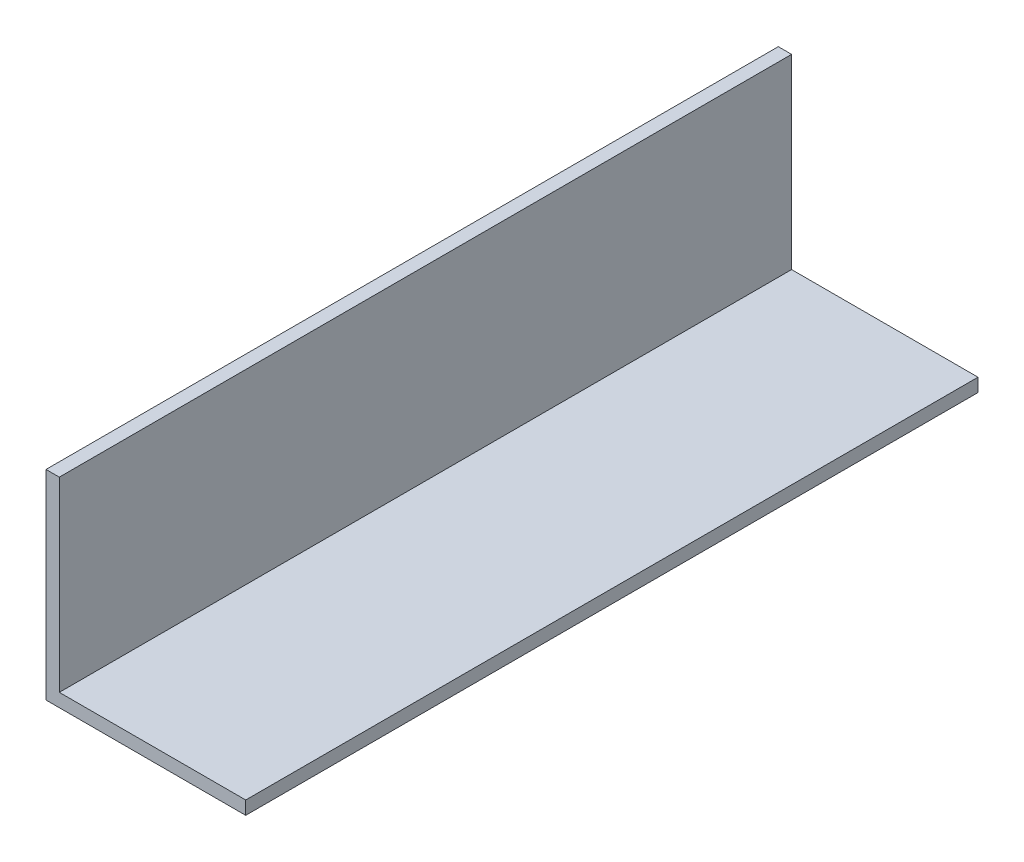
ISO-10303-21;
HEADER;
FILE_DESCRIPTION(('STEP AP214'),'2;1');
FILE_NAME('part.step','',(''),(''),'','','');
FILE_SCHEMA(('AUTOMOTIVE_DESIGN { 1 0 10303 214 1 1 1 1 }'));
ENDSEC;
DATA;
#1=APPLICATION_CONTEXT('core data for automotive mechanical design processes');
#2=APPLICATION_PROTOCOL_DEFINITION('international standard','automotive_design',2000,#1);
#3=PRODUCT_CONTEXT('',#1,'mechanical');
#4=PRODUCT('Part','Part','',(#3));
#5=PRODUCT_RELATED_PRODUCT_CATEGORY('part','',(#4));
#6=PRODUCT_DEFINITION_FORMATION('','',#4);
#7=PRODUCT_DEFINITION_CONTEXT('part definition',#1,'design');
#8=PRODUCT_DEFINITION('design','',#6,#7);
#9=PRODUCT_DEFINITION_SHAPE('','',#8);
#10=(LENGTH_UNIT() NAMED_UNIT(*) SI_UNIT(.MILLI.,.METRE.));
#11=(NAMED_UNIT(*) PLANE_ANGLE_UNIT() SI_UNIT($,.RADIAN.));
#12=(NAMED_UNIT(*) SI_UNIT($,.STERADIAN.) SOLID_ANGLE_UNIT());
#13=UNCERTAINTY_MEASURE_WITH_UNIT(LENGTH_MEASURE(1.E-05),#10,'distance_accuracy_value','');
#14=(GEOMETRIC_REPRESENTATION_CONTEXT(3) GLOBAL_UNCERTAINTY_ASSIGNED_CONTEXT((#13)) GLOBAL_UNIT_ASSIGNED_CONTEXT((#10,
#11,#12)) REPRESENTATION_CONTEXT('',''));
#15=CARTESIAN_POINT('',(0.,0.,0.));
#16=DIRECTION('',(0.,0.,1.));
#17=DIRECTION('',(1.,0.,0.));
#18=AXIS2_PLACEMENT_3D('',#15,#16,#17);
#19=CARTESIAN_POINT('',(30.,0.,110.));
#20=DIRECTION('',(0.,1.,0.));
#21=DIRECTION('',(-1.,0.,0.));
#22=AXIS2_PLACEMENT_3D('',#19,#20,#21);
#23=PLANE('',#22);
#24=DIRECTION('',(1.,0.,0.));
#25=VECTOR('',#24,1.);
#26=CARTESIAN_POINT('',(30.,0.,0.));
#27=LINE('',#26,#25);
#28=CARTESIAN_POINT('',(0.,0.,0.));
#29=VERTEX_POINT('',#28);
#30=CARTESIAN_POINT('',(30.,0.,0.));
#31=VERTEX_POINT('',#30);
#32=EDGE_CURVE('E116',#29,#31,#27,.T.);
#33=ORIENTED_EDGE('',*,*,#32,.T.);
#34=DIRECTION('',(0.,0.,-1.));
#35=VECTOR('',#34,1.);
#36=CARTESIAN_POINT('',(30.,0.,110.));
#37=LINE('',#36,#35);
#38=CARTESIAN_POINT('',(30.,0.,110.));
#39=VERTEX_POINT('',#38);
#40=EDGE_CURVE('E11',#39,#31,#37,.T.);
#41=ORIENTED_EDGE('',*,*,#40,.F.);
#42=DIRECTION('',(1.,0.,0.));
#43=VECTOR('',#42,1.);
#44=CARTESIAN_POINT('',(30.,0.,110.));
#45=LINE('',#44,#43);
#46=CARTESIAN_POINT('',(0.,0.,110.));
#47=VERTEX_POINT('',#46);
#48=EDGE_CURVE('E126',#47,#39,#45,.T.);
#49=ORIENTED_EDGE('',*,*,#48,.F.);
#50=DIRECTION('',(0.,0.,-1.));
#51=VECTOR('',#50,1.);
#52=CARTESIAN_POINT('',(0.,0.,110.));
#53=LINE('',#52,#51);
#54=EDGE_CURVE('E112',#47,#29,#53,.T.);
#55=ORIENTED_EDGE('',*,*,#54,.T.);
#56=EDGE_LOOP('',(#33,#41,#49,#55));
#57=FACE_BOUND('',#56,.T.);
#58=ADVANCED_FACE('F32',(#57),#23,.F.);
#59=CARTESIAN_POINT('',(30.,2.,110.));
#60=DIRECTION('',(-1.,0.,0.));
#61=DIRECTION('',(0.,0.,1.));
#62=AXIS2_PLACEMENT_3D('',#59,#60,#61);
#63=PLANE('',#62);
#64=DIRECTION('',(0.,1.,0.));
#65=VECTOR('',#64,1.);
#66=CARTESIAN_POINT('',(30.,2.,0.));
#67=LINE('',#66,#65);
#68=CARTESIAN_POINT('',(30.,2.,0.));
#69=VERTEX_POINT('',#68);
#70=EDGE_CURVE('E119',#31,#69,#67,.T.);
#71=ORIENTED_EDGE('',*,*,#70,.T.);
#72=DIRECTION('',(0.,0.,-1.));
#73=VECTOR('',#72,1.);
#74=CARTESIAN_POINT('',(30.,2.,110.));
#75=LINE('',#74,#73);
#76=CARTESIAN_POINT('',(30.,2.,110.));
#77=VERTEX_POINT('',#76);
#78=EDGE_CURVE('E40',#77,#69,#75,.T.);
#79=ORIENTED_EDGE('',*,*,#78,.F.);
#80=DIRECTION('',(0.,1.,0.));
#81=VECTOR('',#80,1.);
#82=CARTESIAN_POINT('',(30.,2.,110.));
#83=LINE('',#82,#81);
#84=EDGE_CURVE('E85',#39,#77,#83,.T.);
#85=ORIENTED_EDGE('',*,*,#84,.F.);
#86=ORIENTED_EDGE('',*,*,#40,.T.);
#87=EDGE_LOOP('',(#71,#79,#85,#86));
#88=FACE_BOUND('',#87,.T.);
#89=ADVANCED_FACE('F150',(#88),#63,.F.);
#90=CARTESIAN_POINT('',(2.,2.,110.));
#91=DIRECTION('',(0.,-1.,0.));
#92=DIRECTION('',(1.,0.,0.));
#93=AXIS2_PLACEMENT_3D('',#90,#91,#92);
#94=PLANE('',#93);
#95=DIRECTION('',(-1.,0.,0.));
#96=VECTOR('',#95,1.);
#97=CARTESIAN_POINT('',(2.,2.,0.));
#98=LINE('',#97,#96);
#99=CARTESIAN_POINT('',(2.,2.,0.));
#100=VERTEX_POINT('',#99);
#101=EDGE_CURVE('E121',#69,#100,#98,.T.);
#102=ORIENTED_EDGE('',*,*,#101,.T.);
#103=DIRECTION('',(0.,0.,-1.));
#104=VECTOR('',#103,1.);
#105=CARTESIAN_POINT('',(2.,2.,110.));
#106=LINE('',#105,#104);
#107=CARTESIAN_POINT('',(2.,2.,110.));
#108=VERTEX_POINT('',#107);
#109=EDGE_CURVE('E107',#108,#100,#106,.T.);
#110=ORIENTED_EDGE('',*,*,#109,.F.);
#111=DIRECTION('',(-1.,0.,0.));
#112=VECTOR('',#111,1.);
#113=CARTESIAN_POINT('',(2.,2.,110.));
#114=LINE('',#113,#112);
#115=EDGE_CURVE('E98',#77,#108,#114,.T.);
#116=ORIENTED_EDGE('',*,*,#115,.F.);
#117=ORIENTED_EDGE('',*,*,#78,.T.);
#118=EDGE_LOOP('',(#102,#110,#116,#117));
#119=FACE_BOUND('',#118,.T.);
#120=ADVANCED_FACE('F132',(#119),#94,.F.);
#121=CARTESIAN_POINT('',(2.,30.,110.));
#122=DIRECTION('',(-1.,0.,0.));
#123=DIRECTION('',(0.,-1.,0.));
#124=AXIS2_PLACEMENT_3D('',#121,#122,#123);
#125=PLANE('',#124);
#126=DIRECTION('',(0.,1.,0.));
#127=VECTOR('',#126,1.);
#128=CARTESIAN_POINT('',(2.,30.,0.));
#129=LINE('',#128,#127);
#130=CARTESIAN_POINT('',(2.,30.,0.));
#131=VERTEX_POINT('',#130);
#132=EDGE_CURVE('E106',#100,#131,#129,.T.);
#133=ORIENTED_EDGE('',*,*,#132,.T.);
#134=DIRECTION('',(0.,0.,-1.));
#135=VECTOR('',#134,1.);
#136=CARTESIAN_POINT('',(2.,30.,110.));
#137=LINE('',#136,#135);
#138=CARTESIAN_POINT('',(2.,30.,110.));
#139=VERTEX_POINT('',#138);
#140=EDGE_CURVE('E103',#139,#131,#137,.T.);
#141=ORIENTED_EDGE('',*,*,#140,.F.);
#142=DIRECTION('',(0.,1.,0.));
#143=VECTOR('',#142,1.);
#144=CARTESIAN_POINT('',(2.,30.,110.));
#145=LINE('',#144,#143);
#146=EDGE_CURVE('E92',#108,#139,#145,.T.);
#147=ORIENTED_EDGE('',*,*,#146,.F.);
#148=ORIENTED_EDGE('',*,*,#109,.T.);
#149=EDGE_LOOP('',(#133,#141,#147,#148));
#150=FACE_BOUND('',#149,.T.);
#151=ADVANCED_FACE('F104',(#150),#125,.F.);
#152=CARTESIAN_POINT('',(0.,30.,110.));
#153=DIRECTION('',(0.,-1.,0.));
#154=DIRECTION('',(0.,0.,-1.));
#155=AXIS2_PLACEMENT_3D('',#152,#153,#154);
#156=PLANE('',#155);
#157=DIRECTION('',(-1.,0.,0.));
#158=VECTOR('',#157,1.);
#159=CARTESIAN_POINT('',(0.,30.,0.));
#160=LINE('',#159,#158);
#161=CARTESIAN_POINT('',(0.,30.,0.));
#162=VERTEX_POINT('',#161);
#163=EDGE_CURVE('E71',#131,#162,#160,.T.);
#164=ORIENTED_EDGE('',*,*,#163,.T.);
#165=DIRECTION('',(0.,0.,-1.));
#166=VECTOR('',#165,1.);
#167=CARTESIAN_POINT('',(0.,30.,110.));
#168=LINE('',#167,#166);
#169=CARTESIAN_POINT('',(0.,30.,110.));
#170=VERTEX_POINT('',#169);
#171=EDGE_CURVE('E108',#170,#162,#168,.T.);
#172=ORIENTED_EDGE('',*,*,#171,.F.);
#173=DIRECTION('',(-1.,0.,0.));
#174=VECTOR('',#173,1.);
#175=CARTESIAN_POINT('',(0.,30.,110.));
#176=LINE('',#175,#174);
#177=EDGE_CURVE('E96',#139,#170,#176,.T.);
#178=ORIENTED_EDGE('',*,*,#177,.F.);
#179=ORIENTED_EDGE('',*,*,#140,.T.);
#180=EDGE_LOOP('',(#164,#172,#178,#179));
#181=FACE_BOUND('',#180,.T.);
#182=ADVANCED_FACE('F110',(#181),#156,.F.);
#183=CARTESIAN_POINT('',(0.,0.,110.));
#184=DIRECTION('',(1.,0.,0.));
#185=DIRECTION('',(0.,0.,-1.));
#186=AXIS2_PLACEMENT_3D('',#183,#184,#185);
#187=PLANE('',#186);
#188=DIRECTION('',(0.,-1.,0.));
#189=VECTOR('',#188,1.);
#190=CARTESIAN_POINT('',(0.,0.,0.));
#191=LINE('',#190,#189);
#192=EDGE_CURVE('E77',#162,#29,#191,.T.);
#193=ORIENTED_EDGE('',*,*,#192,.T.);
#194=ORIENTED_EDGE('',*,*,#54,.F.);
#195=DIRECTION('',(0.,-1.,0.));
#196=VECTOR('',#195,1.);
#197=CARTESIAN_POINT('',(0.,0.,110.));
#198=LINE('',#197,#196);
#199=EDGE_CURVE('E48',#170,#47,#198,.T.);
#200=ORIENTED_EDGE('',*,*,#199,.F.);
#201=ORIENTED_EDGE('',*,*,#171,.T.);
#202=EDGE_LOOP('',(#193,#194,#200,#201));
#203=FACE_BOUND('',#202,.T.);
#204=ADVANCED_FACE('F139',(#203),#187,.F.);
#205=CARTESIAN_POINT('',(0.,0.,110.));
#206=DIRECTION('',(0.,0.,-1.));
#207=DIRECTION('',(-1.,0.,0.));
#208=AXIS2_PLACEMENT_3D('',#205,#206,#207);
#209=PLANE('',#208);
#210=ORIENTED_EDGE('',*,*,#48,.T.);
#211=ORIENTED_EDGE('',*,*,#84,.T.);
#212=ORIENTED_EDGE('',*,*,#115,.T.);
#213=ORIENTED_EDGE('',*,*,#146,.T.);
#214=ORIENTED_EDGE('',*,*,#177,.T.);
#215=ORIENTED_EDGE('',*,*,#199,.T.);
#216=EDGE_LOOP('',(#210,#211,#212,#213,#214,#215));
#217=FACE_BOUND('',#216,.T.);
#218=ADVANCED_FACE('F94',(#217),#209,.F.);
#219=CARTESIAN_POINT('',(0.,0.,0.));
#220=DIRECTION('',(0.,0.,-1.));
#221=DIRECTION('',(-1.,0.,0.));
#222=AXIS2_PLACEMENT_3D('',#219,#220,#221);
#223=PLANE('',#222);
#224=ORIENTED_EDGE('',*,*,#32,.F.);
#225=ORIENTED_EDGE('',*,*,#192,.F.);
#226=ORIENTED_EDGE('',*,*,#163,.F.);
#227=ORIENTED_EDGE('',*,*,#132,.F.);
#228=ORIENTED_EDGE('',*,*,#101,.F.);
#229=ORIENTED_EDGE('',*,*,#70,.F.);
#230=EDGE_LOOP('',(#224,#225,#226,#227,#228,#229));
#231=FACE_BOUND('',#230,.T.);
#232=ADVANCED_FACE('F135',(#231),#223,.T.);
#233=CLOSED_SHELL('',(#58,#89,#120,#151,#182,#204,#218,#232));
#234=MANIFOLD_SOLID_BREP('B2',#233);
#235=ADVANCED_BREP_SHAPE_REPRESENTATION('',(#18,#234),#14);
#236=SHAPE_DEFINITION_REPRESENTATION(#9,#235);
ENDSEC;
END-ISO-10303-21;
